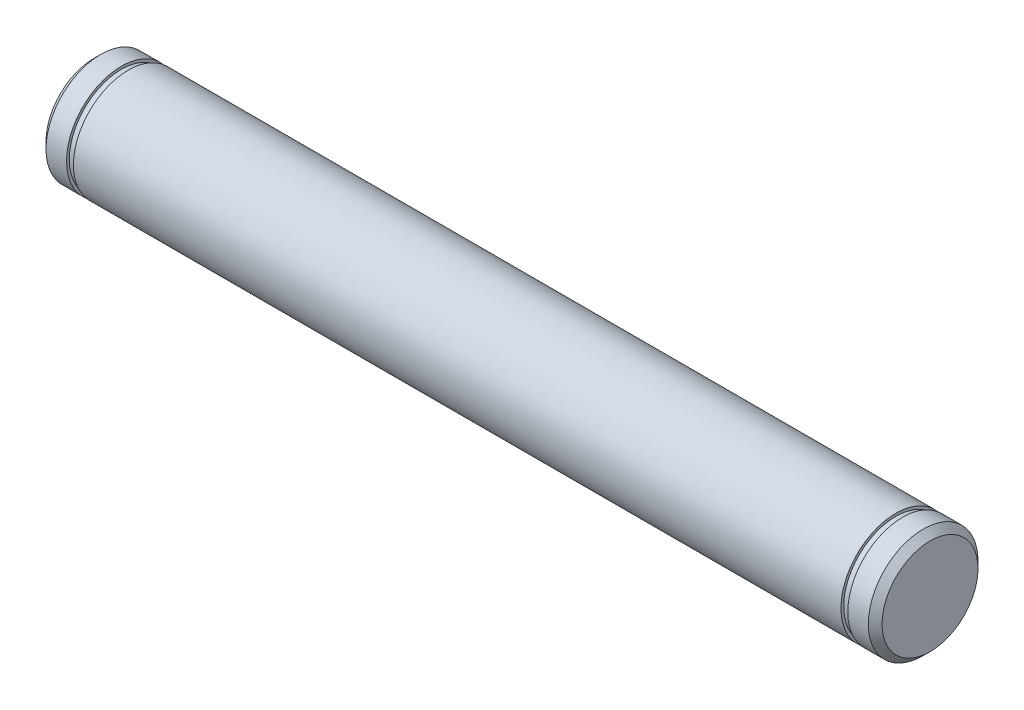
ISO-10303-21;
HEADER;
FILE_DESCRIPTION(('STEP AP214'),'2;1');
FILE_NAME('part.step','',(''),(''),'','','');
FILE_SCHEMA(('AUTOMOTIVE_DESIGN { 1 0 10303 214 1 1 1 1 }'));
ENDSEC;
DATA;
#1=APPLICATION_CONTEXT('core data for automotive mechanical design processes');
#2=APPLICATION_PROTOCOL_DEFINITION('international standard','automotive_design',2000,#1);
#3=PRODUCT_CONTEXT('',#1,'mechanical');
#4=PRODUCT('Part','Part','',(#3));
#5=PRODUCT_RELATED_PRODUCT_CATEGORY('part','',(#4));
#6=PRODUCT_DEFINITION_FORMATION('','',#4);
#7=PRODUCT_DEFINITION_CONTEXT('part definition',#1,'design');
#8=PRODUCT_DEFINITION('design','',#6,#7);
#9=PRODUCT_DEFINITION_SHAPE('','',#8);
#10=(LENGTH_UNIT() NAMED_UNIT(*) SI_UNIT(.MILLI.,.METRE.));
#11=(NAMED_UNIT(*) PLANE_ANGLE_UNIT() SI_UNIT($,.RADIAN.));
#12=(NAMED_UNIT(*) SI_UNIT($,.STERADIAN.) SOLID_ANGLE_UNIT());
#13=UNCERTAINTY_MEASURE_WITH_UNIT(LENGTH_MEASURE(1.E-05),#10,'distance_accuracy_value','');
#14=(GEOMETRIC_REPRESENTATION_CONTEXT(3) GLOBAL_UNCERTAINTY_ASSIGNED_CONTEXT((#13)) GLOBAL_UNIT_ASSIGNED_CONTEXT((#10,
#11,#12)) REPRESENTATION_CONTEXT('',''));
#15=CARTESIAN_POINT('',(0.,0.,0.));
#16=DIRECTION('',(0.,0.,1.));
#17=DIRECTION('',(1.,0.,0.));
#18=AXIS2_PLACEMENT_3D('',#15,#16,#17);
#19=CARTESIAN_POINT('',(30.5,0.,0.));
#20=DIRECTION('',(-1.,0.,0.));
#21=DIRECTION('',(0.,0.,1.));
#22=AXIS2_PLACEMENT_3D('',#19,#20,#21);
#23=CYLINDRICAL_SURFACE('',#22,2.);
#24=CARTESIAN_POINT('',(29.25,0.,0.));
#25=DIRECTION('',(1.,0.,0.));
#26=DIRECTION('',(0.,0.,-1.));
#27=AXIS2_PLACEMENT_3D('',#24,#25,#26);
#28=CIRCLE('',#27,2.);
#29=CARTESIAN_POINT('',(29.25,0.,2.));
#30=VERTEX_POINT('',#29);
#31=EDGE_CURVE('E56',#30,#30,#28,.T.);
#32=CARTESIAN_POINT('',(1.25,0.,0.));
#33=DIRECTION('',(-1.,0.,0.));
#34=DIRECTION('',(0.,0.,1.));
#35=AXIS2_PLACEMENT_3D('',#32,#33,#34);
#36=CIRCLE('',#35,2.);
#37=CARTESIAN_POINT('',(1.25,0.,2.));
#38=VERTEX_POINT('',#37);
#39=EDGE_CURVE('E57',#38,#38,#36,.T.);
#40=CARTESIAN_POINT('',(29.25,0.,2.));
#41=CARTESIAN_POINT('',(28.9583333333333,0.,2.));
#42=CARTESIAN_POINT('',(28.6666666666667,0.,2.));
#43=CARTESIAN_POINT('',(28.0833333333333,0.,2.));
#44=CARTESIAN_POINT('',(27.7916666666667,0.,2.));
#45=CARTESIAN_POINT('',(27.2083333333333,0.,2.));
#46=CARTESIAN_POINT('',(26.9166666666667,0.,2.));
#47=CARTESIAN_POINT('',(26.3333333333333,0.,2.));
#48=CARTESIAN_POINT('',(26.0416666666667,0.,2.));
#49=CARTESIAN_POINT('',(25.4583333333333,0.,2.));
#50=CARTESIAN_POINT('',(25.1666666666667,0.,2.));
#51=CARTESIAN_POINT('',(24.5833333333333,0.,2.));
#52=CARTESIAN_POINT('',(24.2916666666667,0.,2.));
#53=CARTESIAN_POINT('',(23.7083333333333,0.,2.));
#54=CARTESIAN_POINT('',(23.4166666666667,0.,2.));
#55=CARTESIAN_POINT('',(22.8333333333333,0.,2.));
#56=CARTESIAN_POINT('',(22.5416666666667,0.,2.));
#57=CARTESIAN_POINT('',(21.9583333333333,0.,2.));
#58=CARTESIAN_POINT('',(21.6666666666667,0.,2.));
#59=CARTESIAN_POINT('',(21.0833333333333,0.,2.));
#60=CARTESIAN_POINT('',(20.7916666666667,0.,2.));
#61=CARTESIAN_POINT('',(20.2083333333333,0.,2.));
#62=CARTESIAN_POINT('',(19.9166666666667,0.,2.));
#63=CARTESIAN_POINT('',(19.3333333333333,0.,2.));
#64=CARTESIAN_POINT('',(19.0416666666667,0.,2.));
#65=CARTESIAN_POINT('',(18.4583333333333,0.,2.));
#66=CARTESIAN_POINT('',(18.1666666666667,0.,2.));
#67=CARTESIAN_POINT('',(17.5833333333333,0.,2.));
#68=CARTESIAN_POINT('',(17.2916666666667,0.,2.));
#69=CARTESIAN_POINT('',(16.7083333333333,0.,2.));
#70=CARTESIAN_POINT('',(16.4166666666667,0.,2.));
#71=CARTESIAN_POINT('',(15.8333333333333,0.,2.));
#72=CARTESIAN_POINT('',(15.5416666666667,0.,2.));
#73=CARTESIAN_POINT('',(14.9583333333333,0.,2.));
#74=CARTESIAN_POINT('',(14.6666666666667,0.,2.));
#75=CARTESIAN_POINT('',(14.0833333333333,0.,2.));
#76=CARTESIAN_POINT('',(13.7916666666667,0.,2.));
#77=CARTESIAN_POINT('',(13.2083333333333,0.,2.));
#78=CARTESIAN_POINT('',(12.9166666666667,0.,2.));
#79=CARTESIAN_POINT('',(12.3333333333333,0.,2.));
#80=CARTESIAN_POINT('',(12.0416666666667,0.,2.));
#81=CARTESIAN_POINT('',(11.4583333333333,0.,2.));
#82=CARTESIAN_POINT('',(11.1666666666667,0.,2.));
#83=CARTESIAN_POINT('',(10.5833333333333,0.,2.));
#84=CARTESIAN_POINT('',(10.2916666666667,0.,2.));
#85=CARTESIAN_POINT('',(9.70833333333333,0.,2.));
#86=CARTESIAN_POINT('',(9.41666666666667,0.,2.));
#87=CARTESIAN_POINT('',(8.83333333333334,0.,2.));
#88=CARTESIAN_POINT('',(8.54166666666667,0.,2.));
#89=CARTESIAN_POINT('',(7.95833333333334,0.,2.));
#90=CARTESIAN_POINT('',(7.66666666666667,0.,2.));
#91=CARTESIAN_POINT('',(7.08333333333334,0.,2.));
#92=CARTESIAN_POINT('',(6.79166666666667,0.,2.));
#93=CARTESIAN_POINT('',(6.20833333333334,0.,2.));
#94=CARTESIAN_POINT('',(5.91666666666667,0.,2.));
#95=CARTESIAN_POINT('',(5.33333333333334,0.,2.));
#96=CARTESIAN_POINT('',(5.04166666666667,0.,2.));
#97=CARTESIAN_POINT('',(4.45833333333334,0.,2.));
#98=CARTESIAN_POINT('',(4.16666666666667,0.,2.));
#99=CARTESIAN_POINT('',(3.58333333333334,0.,2.));
#100=CARTESIAN_POINT('',(3.29166666666667,0.,2.));
#101=CARTESIAN_POINT('',(2.70833333333334,0.,2.));
#102=CARTESIAN_POINT('',(2.41666666666667,0.,2.));
#103=CARTESIAN_POINT('',(1.83333333333334,0.,2.));
#104=CARTESIAN_POINT('',(1.54166666666667,0.,2.));
#105=CARTESIAN_POINT('',(1.25,0.,2.));
#106=B_SPLINE_CURVE_WITH_KNOTS('',3,(#40,#41,#42,#43,#44,#45,#46,#47,#48,#49,#50,#51,#52,#53,
#54,#55,#56,#57,#58,#59,#60,#61,#62,#63,#64,#65,#66,#67,#68,#69,#70,#71,#72,#73,#74,#75,#76,#77,
#78,#79,#80,#81,#82,#83,#84,#85,#86,#87,#88,#89,#90,#91,#92,#93,#94,#95,#96,#97,#98,#99,#100,
#101,#102,#103,#104,#105),.UNSPECIFIED.,.F.,.F.,(4,2,2,2,2,2,2,2,2,2,2,2,2,2,2,2,2,2,2,2,2,2,2,
2,2,2,2,2,2,2,2,2,4),(0.,0.874999999999997,1.75,2.625,3.5,4.375,5.25,6.12499999999999,7.,7.875,
8.74999999999999,9.62499999999999,10.5,11.375,12.25,13.125,14.,14.875,15.75,16.625,17.5,18.375,
19.25,20.125,21.,21.875,22.75,23.625,24.5,25.375,26.25,27.125,28.),.UNSPECIFIED.);
#107=EDGE_CURVE('BSEAM36',#30,#38,#106,.T.);
#108=ORIENTED_EDGE('',*,*,#31,.F.);
#109=ORIENTED_EDGE('',*,*,#39,.F.);
#110=ORIENTED_EDGE('',*,*,#107,.T.);
#111=ORIENTED_EDGE('',*,*,#107,.F.);
#112=EDGE_LOOP('',(#108,#110,#109,#111));
#113=FACE_BOUND('',#112,.T.);
#114=ADVANCED_FACE('F36',(#113),#23,.T.);
#115=CARTESIAN_POINT('',(29.25,0.,0.));
#116=DIRECTION('',(1.,0.,0.));
#117=DIRECTION('',(0.,0.,-1.));
#118=AXIS2_PLACEMENT_3D('',#115,#116,#117);
#119=PLANE('',#118);
#120=CARTESIAN_POINT('',(29.25,0.,0.));
#121=DIRECTION('',(1.,0.,0.));
#122=DIRECTION('',(0.,0.,-1.));
#123=AXIS2_PLACEMENT_3D('',#120,#121,#122);
#124=CIRCLE('',#123,1.9);
#125=CARTESIAN_POINT('',(29.25,0.,-1.9));
#126=VERTEX_POINT('',#125);
#127=EDGE_CURVE('E70',#126,#126,#124,.T.);
#128=ORIENTED_EDGE('',*,*,#127,.F.);
#129=EDGE_LOOP('',(#128));
#130=FACE_BOUND('',#129,.T.);
#131=ORIENTED_EDGE('',*,*,#31,.T.);
#132=EDGE_LOOP('',(#131));
#133=FACE_BOUND('',#132,.T.);
#134=ADVANCED_FACE('F93',(#130,#133),#119,.T.);
#135=CARTESIAN_POINT('',(29.5,0.,0.));
#136=DIRECTION('',(1.,0.,0.));
#137=DIRECTION('',(0.,0.,-1.));
#138=AXIS2_PLACEMENT_3D('',#135,#136,#137);
#139=PLANE('',#138);
#140=CARTESIAN_POINT('',(29.5,0.,0.));
#141=DIRECTION('',(1.,0.,0.));
#142=DIRECTION('',(0.,0.,-1.));
#143=AXIS2_PLACEMENT_3D('',#140,#141,#142);
#144=CIRCLE('',#143,1.9);
#145=CARTESIAN_POINT('',(29.5,0.,-1.9));
#146=VERTEX_POINT('',#145);
#147=EDGE_CURVE('E60',#146,#146,#144,.T.);
#148=ORIENTED_EDGE('',*,*,#147,.T.);
#149=EDGE_LOOP('',(#148));
#150=FACE_BOUND('',#149,.T.);
#151=CARTESIAN_POINT('',(29.5,0.,0.));
#152=DIRECTION('',(1.,0.,0.));
#153=DIRECTION('',(0.,0.,-1.));
#154=AXIS2_PLACEMENT_3D('',#151,#152,#153);
#155=CIRCLE('',#154,2.);
#156=CARTESIAN_POINT('',(29.5,0.,2.));
#157=VERTEX_POINT('',#156);
#158=EDGE_CURVE('E67',#157,#157,#155,.T.);
#159=ORIENTED_EDGE('',*,*,#158,.F.);
#160=EDGE_LOOP('',(#159));
#161=FACE_BOUND('',#160,.T.);
#162=ADVANCED_FACE('F100',(#150,#161),#139,.F.);
#163=CARTESIAN_POINT('',(29.25,0.,0.));
#164=DIRECTION('',(1.,0.,0.));
#165=DIRECTION('',(0.,0.,-1.));
#166=AXIS2_PLACEMENT_3D('',#163,#164,#165);
#167=CYLINDRICAL_SURFACE('',#166,1.9);
#168=ORIENTED_EDGE('',*,*,#127,.T.);
#169=EDGE_LOOP('',(#168));
#170=FACE_BOUND('',#169,.T.);
#171=ORIENTED_EDGE('',*,*,#147,.F.);
#172=EDGE_LOOP('',(#171));
#173=FACE_BOUND('',#172,.T.);
#174=ADVANCED_FACE('F114',(#170,#173),#167,.T.);
#175=CARTESIAN_POINT('',(30.5,0.,0.));
#176=DIRECTION('',(1.,0.,0.));
#177=DIRECTION('',(0.,0.,-1.));
#178=AXIS2_PLACEMENT_3D('',#175,#176,#177);
#179=PLANE('',#178);
#180=CARTESIAN_POINT('',(30.5,0.,0.));
#181=DIRECTION('',(1.,0.,0.));
#182=DIRECTION('',(0.,0.,-1.));
#183=AXIS2_PLACEMENT_3D('',#180,#181,#182);
#184=CIRCLE('',#183,1.75000000000001);
#185=CARTESIAN_POINT('',(30.5,0.,-1.75000000000001));
#186=VERTEX_POINT('',#185);
#187=EDGE_CURVE('E43',#186,#186,#184,.T.);
#188=ORIENTED_EDGE('',*,*,#187,.T.);
#189=EDGE_LOOP('',(#188));
#190=FACE_BOUND('',#189,.T.);
#191=ADVANCED_FACE('F110',(#190),#179,.T.);
#192=CARTESIAN_POINT('',(30.25,0.,0.));
#193=DIRECTION('',(1.,0.,0.));
#194=DIRECTION('',(0.,0.,-1.));
#195=AXIS2_PLACEMENT_3D('',#192,#193,#194);
#196=CIRCLE('',#195,2.);
#197=CARTESIAN_POINT('',(30.25,0.,2.));
#198=VERTEX_POINT('',#197);
#199=EDGE_CURVE('E10',#198,#198,#196,.F.);
#200=CARTESIAN_POINT('',(30.25,0.,2.));
#201=CARTESIAN_POINT('',(30.2421875,0.,2.));
#202=CARTESIAN_POINT('',(30.234375,0.,2.));
#203=CARTESIAN_POINT('',(30.21875,0.,2.));
#204=CARTESIAN_POINT('',(30.2109375,0.,2.));
#205=CARTESIAN_POINT('',(30.1953125,0.,2.));
#206=CARTESIAN_POINT('',(30.1875,0.,2.));
#207=CARTESIAN_POINT('',(30.171875,0.,2.));
#208=CARTESIAN_POINT('',(30.1640625,0.,2.));
#209=CARTESIAN_POINT('',(30.1484375,0.,2.));
#210=CARTESIAN_POINT('',(30.140625,0.,2.));
#211=CARTESIAN_POINT('',(30.125,0.,2.));
#212=CARTESIAN_POINT('',(30.1171875,0.,2.));
#213=CARTESIAN_POINT('',(30.1015625,0.,2.));
#214=CARTESIAN_POINT('',(30.09375,0.,2.));
#215=CARTESIAN_POINT('',(30.078125,0.,2.));
#216=CARTESIAN_POINT('',(30.0703125,0.,2.));
#217=CARTESIAN_POINT('',(30.0546875,0.,2.));
#218=CARTESIAN_POINT('',(30.046875,0.,2.));
#219=CARTESIAN_POINT('',(30.03125,0.,2.));
#220=CARTESIAN_POINT('',(30.0234375,0.,2.));
#221=CARTESIAN_POINT('',(30.0078125,0.,2.));
#222=CARTESIAN_POINT('',(30.,0.,2.));
#223=CARTESIAN_POINT('',(29.984375,0.,2.));
#224=CARTESIAN_POINT('',(29.9765625,0.,2.));
#225=CARTESIAN_POINT('',(29.9609375,0.,2.));
#226=CARTESIAN_POINT('',(29.953125,0.,2.));
#227=CARTESIAN_POINT('',(29.9375,0.,2.));
#228=CARTESIAN_POINT('',(29.9296875,0.,2.));
#229=CARTESIAN_POINT('',(29.9140625,0.,2.));
#230=CARTESIAN_POINT('',(29.90625,0.,2.));
#231=CARTESIAN_POINT('',(29.890625,0.,2.));
#232=CARTESIAN_POINT('',(29.8828125,0.,2.));
#233=CARTESIAN_POINT('',(29.8671875,0.,2.));
#234=CARTESIAN_POINT('',(29.859375,0.,2.));
#235=CARTESIAN_POINT('',(29.84375,0.,2.));
#236=CARTESIAN_POINT('',(29.8359375,0.,2.));
#237=CARTESIAN_POINT('',(29.8203125,0.,2.));
#238=CARTESIAN_POINT('',(29.8125,0.,2.));
#239=CARTESIAN_POINT('',(29.796875,0.,2.));
#240=CARTESIAN_POINT('',(29.7890625,0.,2.));
#241=CARTESIAN_POINT('',(29.7734375,0.,2.));
#242=CARTESIAN_POINT('',(29.765625,0.,2.));
#243=CARTESIAN_POINT('',(29.75,0.,2.));
#244=CARTESIAN_POINT('',(29.7421875,0.,2.));
#245=CARTESIAN_POINT('',(29.7265625,0.,2.));
#246=CARTESIAN_POINT('',(29.71875,0.,2.));
#247=CARTESIAN_POINT('',(29.703125,0.,2.));
#248=CARTESIAN_POINT('',(29.6953125,0.,2.));
#249=CARTESIAN_POINT('',(29.6796875,0.,2.));
#250=CARTESIAN_POINT('',(29.671875,0.,2.));
#251=CARTESIAN_POINT('',(29.65625,0.,2.));
#252=CARTESIAN_POINT('',(29.6484375,0.,2.));
#253=CARTESIAN_POINT('',(29.6328125,0.,2.));
#254=CARTESIAN_POINT('',(29.625,0.,2.));
#255=CARTESIAN_POINT('',(29.609375,0.,2.));
#256=CARTESIAN_POINT('',(29.6015625,0.,2.));
#257=CARTESIAN_POINT('',(29.5859375,0.,2.));
#258=CARTESIAN_POINT('',(29.578125,0.,2.));
#259=CARTESIAN_POINT('',(29.5625,0.,2.));
#260=CARTESIAN_POINT('',(29.5546875,0.,2.));
#261=CARTESIAN_POINT('',(29.5390625,0.,2.));
#262=CARTESIAN_POINT('',(29.53125,0.,2.));
#263=CARTESIAN_POINT('',(29.515625,0.,2.));
#264=CARTESIAN_POINT('',(29.5078125,0.,2.));
#265=CARTESIAN_POINT('',(29.5,0.,2.));
#266=B_SPLINE_CURVE_WITH_KNOTS('',3,(#200,#201,#202,#203,#204,#205,#206,#207,#208,#209,#210,
#211,#212,#213,#214,#215,#216,#217,#218,#219,#220,#221,#222,#223,#224,#225,#226,#227,#228,#229,
#230,#231,#232,#233,#234,#235,#236,#237,#238,#239,#240,#241,#242,#243,#244,#245,#246,#247,#248,
#249,#250,#251,#252,#253,#254,#255,#256,#257,#258,#259,#260,#261,#262,#263,#264,#265),
.UNSPECIFIED.,.F.,.F.,(4,2,2,2,2,2,2,2,2,2,2,2,2,2,2,2,2,2,2,2,2,2,2,2,2,2,2,2,2,2,2,2,4),(0.,
0.0234374999999974,0.0468749999999983,0.0703124999999992,0.0937500000000001,0.117187500000001,
0.140624999999998,0.164062499999999,0.1875,0.210937500000001,0.234375000000002,
0.257812499999999,0.28125,0.304687500000001,0.328125000000002,0.351562500000003,
0.375000000000004,0.398437500000001,0.421875000000002,0.445312500000003,0.468750000000004,
0.492187500000005,0.515625000000002,0.539062500000003,0.562500000000004,0.585937500000005,
0.609375000000006,0.632812500000007,0.656250000000004,0.679687500000005,0.703125000000006,
0.726562500000007,0.750000000000008),.UNSPECIFIED.);
#267=EDGE_CURVE('BSEAM88',#198,#157,#266,.T.);
#268=ORIENTED_EDGE('',*,*,#199,.T.);
#269=ORIENTED_EDGE('',*,*,#158,.T.);
#270=ORIENTED_EDGE('',*,*,#267,.T.);
#271=ORIENTED_EDGE('',*,*,#267,.F.);
#272=EDGE_LOOP('',(#268,#270,#269,#271));
#273=FACE_BOUND('',#272,.T.);
#274=ADVANCED_FACE('F88',(#273),#23,.T.);
#275=CARTESIAN_POINT('',(1.25,0.,0.));
#276=DIRECTION('',(-1.,0.,0.));
#277=DIRECTION('',(0.,0.,1.));
#278=AXIS2_PLACEMENT_3D('',#275,#276,#277);
#279=PLANE('',#278);
#280=CARTESIAN_POINT('',(1.25,0.,0.));
#281=DIRECTION('',(-1.,0.,0.));
#282=DIRECTION('',(0.,0.,1.));
#283=AXIS2_PLACEMENT_3D('',#280,#281,#282);
#284=CIRCLE('',#283,1.9);
#285=CARTESIAN_POINT('',(1.25,0.,1.9));
#286=VERTEX_POINT('',#285);
#287=EDGE_CURVE('E64',#286,#286,#284,.T.);
#288=ORIENTED_EDGE('',*,*,#287,.F.);
#289=EDGE_LOOP('',(#288));
#290=FACE_BOUND('',#289,.T.);
#291=ORIENTED_EDGE('',*,*,#39,.T.);
#292=EDGE_LOOP('',(#291));
#293=FACE_BOUND('',#292,.T.);
#294=ADVANCED_FACE('F84',(#290,#293),#279,.T.);
#295=CARTESIAN_POINT('',(1.,0.,0.));
#296=DIRECTION('',(-1.,0.,0.));
#297=DIRECTION('',(0.,0.,1.));
#298=AXIS2_PLACEMENT_3D('',#295,#296,#297);
#299=PLANE('',#298);
#300=CARTESIAN_POINT('',(1.,0.,0.));
#301=DIRECTION('',(-1.,0.,0.));
#302=DIRECTION('',(0.,0.,1.));
#303=AXIS2_PLACEMENT_3D('',#300,#301,#302);
#304=CIRCLE('',#303,1.9);
#305=CARTESIAN_POINT('',(1.,0.,1.9));
#306=VERTEX_POINT('',#305);
#307=EDGE_CURVE('E75',#306,#306,#304,.T.);
#308=ORIENTED_EDGE('',*,*,#307,.T.);
#309=EDGE_LOOP('',(#308));
#310=FACE_BOUND('',#309,.T.);
#311=CARTESIAN_POINT('',(1.,0.,0.));
#312=DIRECTION('',(-1.,0.,0.));
#313=DIRECTION('',(0.,0.,1.));
#314=AXIS2_PLACEMENT_3D('',#311,#312,#313);
#315=CIRCLE('',#314,2.);
#316=CARTESIAN_POINT('',(1.,0.,2.));
#317=VERTEX_POINT('',#316);
#318=EDGE_CURVE('E61',#317,#317,#315,.T.);
#319=ORIENTED_EDGE('',*,*,#318,.F.);
#320=EDGE_LOOP('',(#319));
#321=FACE_BOUND('',#320,.T.);
#322=ADVANCED_FACE('F87',(#310,#321),#299,.F.);
#323=CARTESIAN_POINT('',(1.25,0.,0.));
#324=DIRECTION('',(-1.,0.,0.));
#325=DIRECTION('',(0.,0.,1.));
#326=AXIS2_PLACEMENT_3D('',#323,#324,#325);
#327=CYLINDRICAL_SURFACE('',#326,1.9);
#328=ORIENTED_EDGE('',*,*,#287,.T.);
#329=EDGE_LOOP('',(#328));
#330=FACE_BOUND('',#329,.T.);
#331=ORIENTED_EDGE('',*,*,#307,.F.);
#332=EDGE_LOOP('',(#331));
#333=FACE_BOUND('',#332,.T.);
#334=ADVANCED_FACE('F81',(#330,#333),#327,.T.);
#335=CARTESIAN_POINT('',(0.,0.,0.));
#336=DIRECTION('',(1.,0.,0.));
#337=DIRECTION('',(0.,0.,-1.));
#338=AXIS2_PLACEMENT_3D('',#335,#336,#337);
#339=PLANE('',#338);
#340=CARTESIAN_POINT('',(0.,0.,0.));
#341=DIRECTION('',(1.,0.,0.));
#342=DIRECTION('',(0.,0.,-1.));
#343=AXIS2_PLACEMENT_3D('',#340,#341,#342);
#344=CIRCLE('',#343,1.74999999999999);
#345=CARTESIAN_POINT('',(0.,0.,-1.74999999999999));
#346=VERTEX_POINT('',#345);
#347=EDGE_CURVE('E47',#346,#346,#344,.F.);
#348=ORIENTED_EDGE('',*,*,#347,.T.);
#349=EDGE_LOOP('',(#348));
#350=FACE_BOUND('',#349,.T.);
#351=ADVANCED_FACE('F107',(#350),#339,.F.);
#352=CARTESIAN_POINT('',(0.250000000000014,0.,0.));
#353=DIRECTION('',(1.,0.,0.));
#354=DIRECTION('',(0.,0.,-1.));
#355=AXIS2_PLACEMENT_3D('',#352,#353,#354);
#356=CIRCLE('',#355,2.);
#357=CARTESIAN_POINT('',(0.250000000000011,0.,2.));
#358=VERTEX_POINT('',#357);
#359=EDGE_CURVE('E51',#358,#358,#356,.T.);
#360=CARTESIAN_POINT('',(0.250000000000011,0.,2.));
#361=CARTESIAN_POINT('',(0.257812500000011,0.,2.));
#362=CARTESIAN_POINT('',(0.265625000000011,0.,2.));
#363=CARTESIAN_POINT('',(0.281250000000011,0.,2.));
#364=CARTESIAN_POINT('',(0.28906250000001,0.,2.));
#365=CARTESIAN_POINT('',(0.304687500000009,0.,2.));
#366=CARTESIAN_POINT('',(0.31250000000001,0.,2.));
#367=CARTESIAN_POINT('',(0.32812500000001,0.,2.));
#368=CARTESIAN_POINT('',(0.33593750000001,0.,2.));
#369=CARTESIAN_POINT('',(0.35156250000001,0.,2.));
#370=CARTESIAN_POINT('',(0.359375000000009,0.,2.));
#371=CARTESIAN_POINT('',(0.375000000000008,0.,2.));
#372=CARTESIAN_POINT('',(0.382812500000009,0.,2.));
#373=CARTESIAN_POINT('',(0.398437500000009,0.,2.));
#374=CARTESIAN_POINT('',(0.40625000000001,0.,2.));
#375=CARTESIAN_POINT('',(0.42187500000001,0.,2.));
#376=CARTESIAN_POINT('',(0.42968750000001,0.,2.));
#377=CARTESIAN_POINT('',(0.44531250000001,0.,2.));
#378=CARTESIAN_POINT('',(0.453125000000009,0.,2.));
#379=CARTESIAN_POINT('',(0.468750000000008,0.,2.));
#380=CARTESIAN_POINT('',(0.476562500000009,0.,2.));
#381=CARTESIAN_POINT('',(0.492187500000009,0.,2.));
#382=CARTESIAN_POINT('',(0.50000000000001,0.,2.));
#383=CARTESIAN_POINT('',(0.515625000000009,0.,2.));
#384=CARTESIAN_POINT('',(0.523437500000008,0.,2.));
#385=CARTESIAN_POINT('',(0.539062500000008,0.,2.));
#386=CARTESIAN_POINT('',(0.546875000000008,0.,2.));
#387=CARTESIAN_POINT('',(0.562500000000009,0.,2.));
#388=CARTESIAN_POINT('',(0.570312500000009,0.,2.));
#389=CARTESIAN_POINT('',(0.585937500000008,0.,2.));
#390=CARTESIAN_POINT('',(0.593750000000007,0.,2.));
#391=CARTESIAN_POINT('',(0.609375000000007,0.,2.));
#392=CARTESIAN_POINT('',(0.617187500000007,0.,2.));
#393=CARTESIAN_POINT('',(0.632812500000008,0.,2.));
#394=CARTESIAN_POINT('',(0.640625000000008,0.,2.));
#395=CARTESIAN_POINT('',(0.656250000000008,0.,2.));
#396=CARTESIAN_POINT('',(0.664062500000007,0.,2.));
#397=CARTESIAN_POINT('',(0.679687500000006,0.,2.));
#398=CARTESIAN_POINT('',(0.687500000000006,0.,2.));
#399=CARTESIAN_POINT('',(0.703125000000007,0.,2.));
#400=CARTESIAN_POINT('',(0.710937500000007,0.,2.));
#401=CARTESIAN_POINT('',(0.726562500000007,0.,2.));
#402=CARTESIAN_POINT('',(0.734375000000006,0.,2.));
#403=CARTESIAN_POINT('',(0.750000000000005,0.,2.));
#404=CARTESIAN_POINT('',(0.757812500000006,0.,2.));
#405=CARTESIAN_POINT('',(0.773437500000006,0.,2.));
#406=CARTESIAN_POINT('',(0.781250000000006,0.,2.));
#407=CARTESIAN_POINT('',(0.796875000000006,0.,2.));
#408=CARTESIAN_POINT('',(0.804687500000005,0.,2.));
#409=CARTESIAN_POINT('',(0.820312500000005,0.,2.));
#410=CARTESIAN_POINT('',(0.828125000000005,0.,2.));
#411=CARTESIAN_POINT('',(0.843750000000005,0.,2.));
#412=CARTESIAN_POINT('',(0.851562500000006,0.,2.));
#413=CARTESIAN_POINT('',(0.867187500000006,0.,2.));
#414=CARTESIAN_POINT('',(0.875000000000007,0.,2.));
#415=CARTESIAN_POINT('',(0.890625000000006,0.,2.));
#416=CARTESIAN_POINT('',(0.898437500000005,0.,2.));
#417=CARTESIAN_POINT('',(0.914062500000005,0.,2.));
#418=CARTESIAN_POINT('',(0.921875000000005,0.,2.));
#419=CARTESIAN_POINT('',(0.937500000000005,0.,2.));
#420=CARTESIAN_POINT('',(0.945312500000006,0.,2.));
#421=CARTESIAN_POINT('',(0.960937500000005,0.,2.));
#422=CARTESIAN_POINT('',(0.968750000000004,0.,2.));
#423=CARTESIAN_POINT('',(0.984375000000004,0.,2.));
#424=CARTESIAN_POINT('',(0.992187500000004,0.,2.));
#425=CARTESIAN_POINT('',(1.,0.,2.));
#426=B_SPLINE_CURVE_WITH_KNOTS('',3,(#360,#361,#362,#363,#364,#365,#366,#367,#368,#369,#370,
#371,#372,#373,#374,#375,#376,#377,#378,#379,#380,#381,#382,#383,#384,#385,#386,#387,#388,#389,
#390,#391,#392,#393,#394,#395,#396,#397,#398,#399,#400,#401,#402,#403,#404,#405,#406,#407,#408,
#409,#410,#411,#412,#413,#414,#415,#416,#417,#418,#419,#420,#421,#422,#423,#424,#425),
.UNSPECIFIED.,.F.,.F.,(4,2,2,2,2,2,2,2,2,2,2,2,2,2,2,2,2,2,2,2,2,2,2,2,2,2,2,2,2,2,2,2,4),(0.,
0.0234375000000009,0.0468749999999983,0.0703124999999992,0.0937500000000001,0.117187499999998,
0.140624999999998,0.164062499999999,0.1875,0.210937499999998,0.234374999999998,
0.257812499999999,0.281249999999997,0.304687499999998,0.328124999999999,0.351562499999996,
0.374999999999997,0.398437499999998,0.421874999999995,0.445312499999996,0.468749999999997,
0.492187499999994,0.515624999999995,0.539062499999996,0.562499999999994,0.585937499999994,
0.609374999999995,0.632812499999996,0.656249999999994,0.679687499999995,0.703124999999995,
0.726562499999993,0.749999999999994),.UNSPECIFIED.);
#427=EDGE_CURVE('BSEAM96',#358,#317,#426,.T.);
#428=ORIENTED_EDGE('',*,*,#359,.T.);
#429=ORIENTED_EDGE('',*,*,#318,.T.);
#430=ORIENTED_EDGE('',*,*,#427,.T.);
#431=ORIENTED_EDGE('',*,*,#427,.F.);
#432=EDGE_LOOP('',(#428,#430,#429,#431));
#433=FACE_BOUND('',#432,.T.);
#434=ADVANCED_FACE('F96',(#433),#23,.T.);
#435=CARTESIAN_POINT('',(0.250000000000014,0.,0.));
#436=DIRECTION('',(1.,0.,0.));
#437=DIRECTION('',(0.,0.,-1.));
#438=AXIS2_PLACEMENT_3D('',#435,#436,#437);
#439=CONICAL_SURFACE('',#438,2.,0.785398163397446);
#440=ORIENTED_EDGE('',*,*,#347,.F.);
#441=EDGE_LOOP('',(#440));
#442=FACE_BOUND('',#441,.T.);
#443=ORIENTED_EDGE('',*,*,#359,.F.);
#444=EDGE_LOOP('',(#443));
#445=FACE_BOUND('',#444,.T.);
#446=ADVANCED_FACE('F106',(#442,#445),#439,.T.);
#447=CARTESIAN_POINT('',(30.5,0.,0.));
#448=DIRECTION('',(-1.,0.,0.));
#449=DIRECTION('',(0.,0.,1.));
#450=AXIS2_PLACEMENT_3D('',#447,#448,#449);
#451=CONICAL_SURFACE('',#450,1.75000000000001,0.785398163397439);
#452=ORIENTED_EDGE('',*,*,#199,.F.);
#453=EDGE_LOOP('',(#452));
#454=FACE_BOUND('',#453,.T.);
#455=ORIENTED_EDGE('',*,*,#187,.F.);
#456=EDGE_LOOP('',(#455));
#457=FACE_BOUND('',#456,.T.);
#458=ADVANCED_FACE('F38',(#454,#457),#451,.T.);
#459=CLOSED_SHELL('',(#114,#134,#162,#174,#191,#274,#294,#322,#334,#351,#434,#446,#458));
#460=MANIFOLD_SOLID_BREP('B2',#459);
#461=ADVANCED_BREP_SHAPE_REPRESENTATION('',(#18,#460),#14);
#462=SHAPE_DEFINITION_REPRESENTATION(#9,#461);
ENDSEC;
END-ISO-10303-21;
